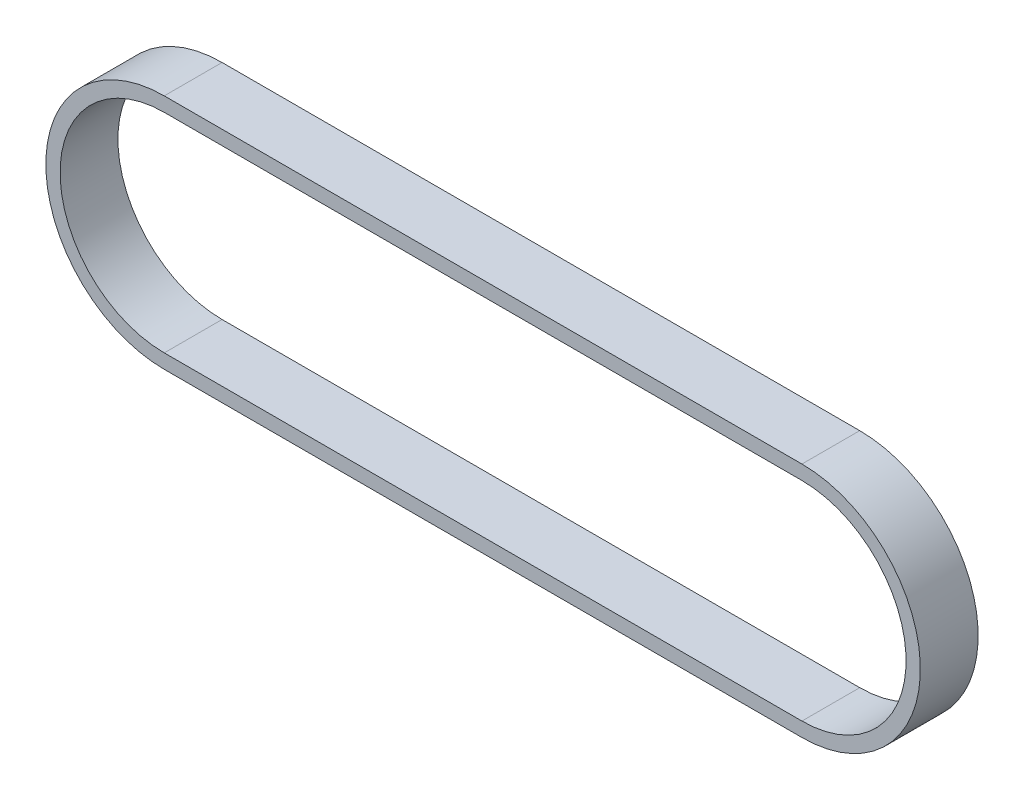
ISO-10303-21;
HEADER;
FILE_DESCRIPTION(('STEP AP214'),'2;1');
FILE_NAME('part.step','',(''),(''),'','','');
FILE_SCHEMA(('AUTOMOTIVE_DESIGN { 1 0 10303 214 1 1 1 1 }'));
ENDSEC;
DATA;
#1=APPLICATION_CONTEXT('core data for automotive mechanical design processes');
#2=APPLICATION_PROTOCOL_DEFINITION('international standard','automotive_design',2000,#1);
#3=PRODUCT_CONTEXT('',#1,'mechanical');
#4=PRODUCT('Part','Part','',(#3));
#5=PRODUCT_RELATED_PRODUCT_CATEGORY('part','',(#4));
#6=PRODUCT_DEFINITION_FORMATION('','',#4);
#7=PRODUCT_DEFINITION_CONTEXT('part definition',#1,'design');
#8=PRODUCT_DEFINITION('design','',#6,#7);
#9=PRODUCT_DEFINITION_SHAPE('','',#8);
#10=(LENGTH_UNIT() NAMED_UNIT(*) SI_UNIT(.MILLI.,.METRE.));
#11=(NAMED_UNIT(*) PLANE_ANGLE_UNIT() SI_UNIT($,.RADIAN.));
#12=(NAMED_UNIT(*) SI_UNIT($,.STERADIAN.) SOLID_ANGLE_UNIT());
#13=UNCERTAINTY_MEASURE_WITH_UNIT(LENGTH_MEASURE(1.E-05),#10,'distance_accuracy_value','');
#14=(GEOMETRIC_REPRESENTATION_CONTEXT(3) GLOBAL_UNCERTAINTY_ASSIGNED_CONTEXT((#13)) GLOBAL_UNIT_ASSIGNED_CONTEXT((#10,
#11,#12)) REPRESENTATION_CONTEXT('',''));
#15=CARTESIAN_POINT('',(0.,0.,0.));
#16=DIRECTION('',(0.,0.,1.));
#17=DIRECTION('',(1.,0.,0.));
#18=AXIS2_PLACEMENT_3D('',#15,#16,#17);
#19=CARTESIAN_POINT('',(0.,0.,9.52));
#20=DIRECTION('',(0.,0.,1.));
#21=DIRECTION('',(1.,0.,0.));
#22=AXIS2_PLACEMENT_3D('',#19,#20,#21);
#23=PLANE('',#22);
#24=CARTESIAN_POINT('',(0.,0.,9.52));
#25=DIRECTION('',(0.,0.,1.));
#26=DIRECTION('',(1.,0.,0.));
#27=AXIS2_PLACEMENT_3D('',#24,#25,#26);
#28=CIRCLE('',#27,19.5);
#29=CARTESIAN_POINT('',(0.,19.5,9.52));
#30=VERTEX_POINT('',#29);
#31=CARTESIAN_POINT('',(0.,-19.5,9.52));
#32=VERTEX_POINT('',#31);
#33=EDGE_CURVE('E157',#30,#32,#28,.T.);
#34=ORIENTED_EDGE('',*,*,#33,.T.);
#35=DIRECTION('',(1.,0.,0.));
#36=VECTOR('',#35,1.);
#37=CARTESIAN_POINT('',(0.,-19.5,9.52));
#38=LINE('',#37,#36);
#39=CARTESIAN_POINT('',(105.,-19.5,9.52));
#40=VERTEX_POINT('',#39);
#41=EDGE_CURVE('E161',#32,#40,#38,.T.);
#42=ORIENTED_EDGE('',*,*,#41,.T.);
#43=CARTESIAN_POINT('',(105.,0.,9.52));
#44=DIRECTION('',(0.,0.,1.));
#45=DIRECTION('',(1.,0.,0.));
#46=AXIS2_PLACEMENT_3D('',#43,#44,#45);
#47=CIRCLE('',#46,19.5);
#48=CARTESIAN_POINT('',(105.,19.5,9.52));
#49=VERTEX_POINT('',#48);
#50=EDGE_CURVE('E165',#40,#49,#47,.T.);
#51=ORIENTED_EDGE('',*,*,#50,.T.);
#52=DIRECTION('',(-1.,0.,0.));
#53=VECTOR('',#52,1.);
#54=CARTESIAN_POINT('',(0.,19.5,9.52));
#55=LINE('',#54,#53);
#56=EDGE_CURVE('E168',#49,#30,#55,.T.);
#57=ORIENTED_EDGE('',*,*,#56,.T.);
#58=EDGE_LOOP('',(#34,#42,#51,#57));
#59=FACE_BOUND('',#58,.T.);
#60=DIRECTION('',(1.,0.,0.));
#61=VECTOR('',#60,1.);
#62=CARTESIAN_POINT('',(0.,-17.15,9.52));
#63=LINE('',#62,#61);
#64=CARTESIAN_POINT('',(0.,-17.15,9.52));
#65=VERTEX_POINT('',#64);
#66=CARTESIAN_POINT('',(105.,-17.15,9.52));
#67=VERTEX_POINT('',#66);
#68=EDGE_CURVE('E118',#65,#67,#63,.T.);
#69=ORIENTED_EDGE('',*,*,#68,.F.);
#70=CARTESIAN_POINT('',(0.,0.,9.52));
#71=DIRECTION('',(0.,0.,1.));
#72=DIRECTION('',(1.,0.,0.));
#73=AXIS2_PLACEMENT_3D('',#70,#71,#72);
#74=CIRCLE('',#73,17.15);
#75=CARTESIAN_POINT('',(0.,17.15,9.52));
#76=VERTEX_POINT('',#75);
#77=EDGE_CURVE('E109',#76,#65,#74,.T.);
#78=ORIENTED_EDGE('',*,*,#77,.F.);
#79=DIRECTION('',(-1.,0.,0.));
#80=VECTOR('',#79,1.);
#81=CARTESIAN_POINT('',(0.,17.15,9.52));
#82=LINE('',#81,#80);
#83=CARTESIAN_POINT('',(105.,17.15,9.52));
#84=VERTEX_POINT('',#83);
#85=EDGE_CURVE('E135',#84,#76,#82,.T.);
#86=ORIENTED_EDGE('',*,*,#85,.F.);
#87=CARTESIAN_POINT('',(105.,0.,9.52));
#88=DIRECTION('',(0.,0.,1.));
#89=DIRECTION('',(1.,0.,0.));
#90=AXIS2_PLACEMENT_3D('',#87,#88,#89);
#91=CIRCLE('',#90,17.15);
#92=EDGE_CURVE('E131',#67,#84,#91,.T.);
#93=ORIENTED_EDGE('',*,*,#92,.F.);
#94=EDGE_LOOP('',(#69,#78,#86,#93));
#95=FACE_BOUND('',#94,.T.);
#96=ADVANCED_FACE('F43',(#59,#95),#23,.T.);
#97=CARTESIAN_POINT('',(0.,0.,0.));
#98=DIRECTION('',(0.,0.,1.));
#99=DIRECTION('',(1.,0.,0.));
#100=AXIS2_PLACEMENT_3D('',#97,#98,#99);
#101=PLANE('',#100);
#102=CARTESIAN_POINT('',(0.,0.,0.));
#103=DIRECTION('',(0.,0.,1.));
#104=DIRECTION('',(1.,0.,0.));
#105=AXIS2_PLACEMENT_3D('',#102,#103,#104);
#106=CIRCLE('',#105,19.5);
#107=CARTESIAN_POINT('',(0.,19.5,0.));
#108=VERTEX_POINT('',#107);
#109=CARTESIAN_POINT('',(0.,-19.5,0.));
#110=VERTEX_POINT('',#109);
#111=EDGE_CURVE('E127',#108,#110,#106,.T.);
#112=ORIENTED_EDGE('',*,*,#111,.F.);
#113=DIRECTION('',(-1.,0.,0.));
#114=VECTOR('',#113,1.);
#115=CARTESIAN_POINT('',(0.,19.5,0.));
#116=LINE('',#115,#114);
#117=CARTESIAN_POINT('',(105.,19.5,0.));
#118=VERTEX_POINT('',#117);
#119=EDGE_CURVE('E162',#118,#108,#116,.T.);
#120=ORIENTED_EDGE('',*,*,#119,.F.);
#121=CARTESIAN_POINT('',(105.,0.,0.));
#122=DIRECTION('',(0.,0.,1.));
#123=DIRECTION('',(1.,0.,0.));
#124=AXIS2_PLACEMENT_3D('',#121,#122,#123);
#125=CIRCLE('',#124,19.5);
#126=CARTESIAN_POINT('',(105.,-19.5,0.));
#127=VERTEX_POINT('',#126);
#128=EDGE_CURVE('E178',#127,#118,#125,.T.);
#129=ORIENTED_EDGE('',*,*,#128,.F.);
#130=DIRECTION('',(1.,0.,0.));
#131=VECTOR('',#130,1.);
#132=CARTESIAN_POINT('',(0.,-19.5,0.));
#133=LINE('',#132,#131);
#134=EDGE_CURVE('E175',#110,#127,#133,.T.);
#135=ORIENTED_EDGE('',*,*,#134,.F.);
#136=EDGE_LOOP('',(#112,#120,#129,#135));
#137=FACE_BOUND('',#136,.T.);
#138=CARTESIAN_POINT('',(0.,0.,0.));
#139=DIRECTION('',(0.,0.,1.));
#140=DIRECTION('',(1.,0.,0.));
#141=AXIS2_PLACEMENT_3D('',#138,#139,#140);
#142=CIRCLE('',#141,17.15);
#143=CARTESIAN_POINT('',(0.,17.15,0.));
#144=VERTEX_POINT('',#143);
#145=CARTESIAN_POINT('',(0.,-17.15,0.));
#146=VERTEX_POINT('',#145);
#147=EDGE_CURVE('E67',#144,#146,#142,.T.);
#148=ORIENTED_EDGE('',*,*,#147,.T.);
#149=DIRECTION('',(1.,0.,0.));
#150=VECTOR('',#149,1.);
#151=CARTESIAN_POINT('',(0.,-17.15,0.));
#152=LINE('',#151,#150);
#153=CARTESIAN_POINT('',(105.,-17.15,0.));
#154=VERTEX_POINT('',#153);
#155=EDGE_CURVE('E125',#146,#154,#152,.T.);
#156=ORIENTED_EDGE('',*,*,#155,.T.);
#157=CARTESIAN_POINT('',(105.,0.,0.));
#158=DIRECTION('',(0.,0.,1.));
#159=DIRECTION('',(1.,0.,0.));
#160=AXIS2_PLACEMENT_3D('',#157,#158,#159);
#161=CIRCLE('',#160,17.15);
#162=CARTESIAN_POINT('',(105.,17.15,0.));
#163=VERTEX_POINT('',#162);
#164=EDGE_CURVE('E144',#154,#163,#161,.T.);
#165=ORIENTED_EDGE('',*,*,#164,.T.);
#166=DIRECTION('',(-1.,0.,0.));
#167=VECTOR('',#166,1.);
#168=CARTESIAN_POINT('',(0.,17.15,0.));
#169=LINE('',#168,#167);
#170=EDGE_CURVE('E119',#163,#144,#169,.T.);
#171=ORIENTED_EDGE('',*,*,#170,.T.);
#172=EDGE_LOOP('',(#148,#156,#165,#171));
#173=FACE_BOUND('',#172,.T.);
#174=ADVANCED_FACE('F201',(#137,#173),#101,.F.);
#175=CARTESIAN_POINT('',(0.,0.,9.52));
#176=DIRECTION('',(0.,0.,-1.));
#177=DIRECTION('',(-1.,0.,0.));
#178=AXIS2_PLACEMENT_3D('',#175,#176,#177);
#179=CYLINDRICAL_SURFACE('',#178,19.5);
#180=ORIENTED_EDGE('',*,*,#111,.T.);
#181=DIRECTION('',(0.,0.,-1.));
#182=VECTOR('',#181,1.);
#183=CARTESIAN_POINT('',(0.,-19.5,9.52));
#184=LINE('',#183,#182);
#185=EDGE_CURVE('E11',#32,#110,#184,.T.);
#186=ORIENTED_EDGE('',*,*,#185,.F.);
#187=ORIENTED_EDGE('',*,*,#33,.F.);
#188=DIRECTION('',(0.,0.,-1.));
#189=VECTOR('',#188,1.);
#190=CARTESIAN_POINT('',(0.,19.5,9.52));
#191=LINE('',#190,#189);
#192=EDGE_CURVE('E171',#30,#108,#191,.T.);
#193=ORIENTED_EDGE('',*,*,#192,.T.);
#194=EDGE_LOOP('',(#180,#186,#187,#193));
#195=FACE_BOUND('',#194,.T.);
#196=ADVANCED_FACE('F45',(#195),#179,.T.);
#197=CARTESIAN_POINT('',(0.,-19.5,9.52));
#198=DIRECTION('',(0.,1.,0.));
#199=DIRECTION('',(0.,0.,1.));
#200=AXIS2_PLACEMENT_3D('',#197,#198,#199);
#201=PLANE('',#200);
#202=ORIENTED_EDGE('',*,*,#134,.T.);
#203=DIRECTION('',(0.,0.,-1.));
#204=VECTOR('',#203,1.);
#205=CARTESIAN_POINT('',(105.,-19.5,9.52));
#206=LINE('',#205,#204);
#207=EDGE_CURVE('E52',#40,#127,#206,.T.);
#208=ORIENTED_EDGE('',*,*,#207,.F.);
#209=ORIENTED_EDGE('',*,*,#41,.F.);
#210=ORIENTED_EDGE('',*,*,#185,.T.);
#211=EDGE_LOOP('',(#202,#208,#209,#210));
#212=FACE_BOUND('',#211,.T.);
#213=ADVANCED_FACE('F211',(#212),#201,.F.);
#214=CARTESIAN_POINT('',(105.,0.,9.52));
#215=DIRECTION('',(0.,0.,-1.));
#216=DIRECTION('',(-1.,0.,0.));
#217=AXIS2_PLACEMENT_3D('',#214,#215,#216);
#218=CYLINDRICAL_SURFACE('',#217,19.5);
#219=ORIENTED_EDGE('',*,*,#128,.T.);
#220=DIRECTION('',(0.,0.,-1.));
#221=VECTOR('',#220,1.);
#222=CARTESIAN_POINT('',(105.,19.5,9.52));
#223=LINE('',#222,#221);
#224=EDGE_CURVE('E186',#49,#118,#223,.T.);
#225=ORIENTED_EDGE('',*,*,#224,.F.);
#226=ORIENTED_EDGE('',*,*,#50,.F.);
#227=ORIENTED_EDGE('',*,*,#207,.T.);
#228=EDGE_LOOP('',(#219,#225,#226,#227));
#229=FACE_BOUND('',#228,.T.);
#230=ADVANCED_FACE('F195',(#229),#218,.T.);
#231=CARTESIAN_POINT('',(0.,19.5,9.52));
#232=DIRECTION('',(0.,-1.,0.));
#233=DIRECTION('',(0.,0.,-1.));
#234=AXIS2_PLACEMENT_3D('',#231,#232,#233);
#235=PLANE('',#234);
#236=ORIENTED_EDGE('',*,*,#119,.T.);
#237=ORIENTED_EDGE('',*,*,#192,.F.);
#238=ORIENTED_EDGE('',*,*,#56,.F.);
#239=ORIENTED_EDGE('',*,*,#224,.T.);
#240=EDGE_LOOP('',(#236,#237,#238,#239));
#241=FACE_BOUND('',#240,.T.);
#242=ADVANCED_FACE('F205',(#241),#235,.F.);
#243=CARTESIAN_POINT('',(0.,0.,9.52));
#244=DIRECTION('',(0.,0.,-1.));
#245=DIRECTION('',(-1.,0.,0.));
#246=AXIS2_PLACEMENT_3D('',#243,#244,#245);
#247=CYLINDRICAL_SURFACE('',#246,17.15);
#248=ORIENTED_EDGE('',*,*,#147,.F.);
#249=DIRECTION('',(0.,0.,-1.));
#250=VECTOR('',#249,1.);
#251=CARTESIAN_POINT('',(0.,17.15,9.52));
#252=LINE('',#251,#250);
#253=EDGE_CURVE('E113',#76,#144,#252,.T.);
#254=ORIENTED_EDGE('',*,*,#253,.F.);
#255=ORIENTED_EDGE('',*,*,#77,.T.);
#256=DIRECTION('',(0.,0.,-1.));
#257=VECTOR('',#256,1.);
#258=CARTESIAN_POINT('',(0.,-17.15,9.52));
#259=LINE('',#258,#257);
#260=EDGE_CURVE('E112',#65,#146,#259,.T.);
#261=ORIENTED_EDGE('',*,*,#260,.T.);
#262=EDGE_LOOP('',(#248,#254,#255,#261));
#263=FACE_BOUND('',#262,.T.);
#264=ADVANCED_FACE('F111',(#263),#247,.F.);
#265=CARTESIAN_POINT('',(0.,-17.15,9.52));
#266=DIRECTION('',(0.,1.,0.));
#267=DIRECTION('',(0.,0.,1.));
#268=AXIS2_PLACEMENT_3D('',#265,#266,#267);
#269=PLANE('',#268);
#270=ORIENTED_EDGE('',*,*,#155,.F.);
#271=ORIENTED_EDGE('',*,*,#260,.F.);
#272=ORIENTED_EDGE('',*,*,#68,.T.);
#273=DIRECTION('',(0.,0.,-1.));
#274=VECTOR('',#273,1.);
#275=CARTESIAN_POINT('',(105.,-17.15,9.52));
#276=LINE('',#275,#274);
#277=EDGE_CURVE('E128',#67,#154,#276,.T.);
#278=ORIENTED_EDGE('',*,*,#277,.T.);
#279=EDGE_LOOP('',(#270,#271,#272,#278));
#280=FACE_BOUND('',#279,.T.);
#281=ADVANCED_FACE('F122',(#280),#269,.T.);
#282=CARTESIAN_POINT('',(105.,0.,9.52));
#283=DIRECTION('',(0.,0.,-1.));
#284=DIRECTION('',(-1.,0.,0.));
#285=AXIS2_PLACEMENT_3D('',#282,#283,#284);
#286=CYLINDRICAL_SURFACE('',#285,17.15);
#287=ORIENTED_EDGE('',*,*,#164,.F.);
#288=ORIENTED_EDGE('',*,*,#277,.F.);
#289=ORIENTED_EDGE('',*,*,#92,.T.);
#290=DIRECTION('',(0.,0.,-1.));
#291=VECTOR('',#290,1.);
#292=CARTESIAN_POINT('',(105.,17.15,9.52));
#293=LINE('',#292,#291);
#294=EDGE_CURVE('E59',#84,#163,#293,.T.);
#295=ORIENTED_EDGE('',*,*,#294,.T.);
#296=EDGE_LOOP('',(#287,#288,#289,#295));
#297=FACE_BOUND('',#296,.T.);
#298=ADVANCED_FACE('F234',(#297),#286,.F.);
#299=CARTESIAN_POINT('',(0.,17.15,9.52));
#300=DIRECTION('',(0.,-1.,0.));
#301=DIRECTION('',(0.,0.,-1.));
#302=AXIS2_PLACEMENT_3D('',#299,#300,#301);
#303=PLANE('',#302);
#304=ORIENTED_EDGE('',*,*,#170,.F.);
#305=ORIENTED_EDGE('',*,*,#294,.F.);
#306=ORIENTED_EDGE('',*,*,#85,.T.);
#307=ORIENTED_EDGE('',*,*,#253,.T.);
#308=EDGE_LOOP('',(#304,#305,#306,#307));
#309=FACE_BOUND('',#308,.T.);
#310=ADVANCED_FACE('F238',(#309),#303,.T.);
#311=CLOSED_SHELL('',(#96,#174,#196,#213,#230,#242,#264,#281,#298,#310));
#312=MANIFOLD_SOLID_BREP('B2',#311);
#313=ADVANCED_BREP_SHAPE_REPRESENTATION('',(#18,#312),#14);
#314=SHAPE_DEFINITION_REPRESENTATION(#9,#313);
ENDSEC;
END-ISO-10303-21;
